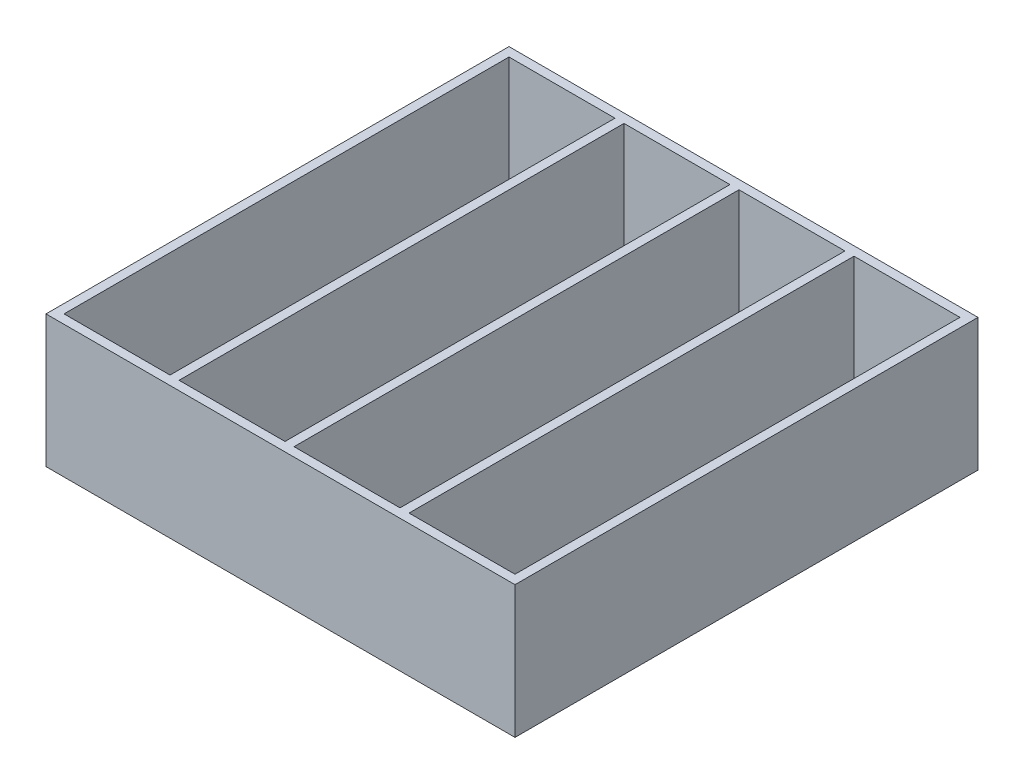
ISO-10303-21;
HEADER;
FILE_DESCRIPTION(('STEP AP214'),'2;1');
FILE_NAME('part.step','',(''),(''),'','','');
FILE_SCHEMA(('AUTOMOTIVE_DESIGN { 1 0 10303 214 1 1 1 1 }'));
ENDSEC;
DATA;
#1=APPLICATION_CONTEXT('core data for automotive mechanical design processes');
#2=APPLICATION_PROTOCOL_DEFINITION('international standard','automotive_design',2000,#1);
#3=PRODUCT_CONTEXT('',#1,'mechanical');
#4=PRODUCT('Part','Part','',(#3));
#5=PRODUCT_RELATED_PRODUCT_CATEGORY('part','',(#4));
#6=PRODUCT_DEFINITION_FORMATION('','',#4);
#7=PRODUCT_DEFINITION_CONTEXT('part definition',#1,'design');
#8=PRODUCT_DEFINITION('design','',#6,#7);
#9=PRODUCT_DEFINITION_SHAPE('','',#8);
#10=(LENGTH_UNIT() NAMED_UNIT(*) SI_UNIT(.MILLI.,.METRE.));
#11=(NAMED_UNIT(*) PLANE_ANGLE_UNIT() SI_UNIT($,.RADIAN.));
#12=(NAMED_UNIT(*) SI_UNIT($,.STERADIAN.) SOLID_ANGLE_UNIT());
#13=UNCERTAINTY_MEASURE_WITH_UNIT(LENGTH_MEASURE(1.E-05),#10,'distance_accuracy_value','');
#14=(GEOMETRIC_REPRESENTATION_CONTEXT(3) GLOBAL_UNCERTAINTY_ASSIGNED_CONTEXT((#13)) GLOBAL_UNIT_ASSIGNED_CONTEXT((#10,
#11,#12)) REPRESENTATION_CONTEXT('',''));
#15=CARTESIAN_POINT('',(0.,0.,0.));
#16=DIRECTION('',(0.,0.,1.));
#17=DIRECTION('',(1.,0.,0.));
#18=AXIS2_PLACEMENT_3D('',#15,#16,#17);
#19=CARTESIAN_POINT('',(0.,22.,0.));
#20=DIRECTION('',(-1.,0.,0.));
#21=DIRECTION('',(0.,0.,1.));
#22=AXIS2_PLACEMENT_3D('',#19,#20,#21);
#23=PLANE('',#22);
#24=DIRECTION('',(0.,0.,-1.));
#25=VECTOR('',#24,1.);
#26=CARTESIAN_POINT('',(0.,0.,0.));
#27=LINE('',#26,#25);
#28=CARTESIAN_POINT('',(0.,0.,77.));
#29=VERTEX_POINT('',#28);
#30=CARTESIAN_POINT('',(0.,0.,0.));
#31=VERTEX_POINT('',#30);
#32=EDGE_CURVE('E204',#29,#31,#27,.T.);
#33=ORIENTED_EDGE('',*,*,#32,.T.);
#34=DIRECTION('',(0.,-1.,0.));
#35=VECTOR('',#34,1.);
#36=CARTESIAN_POINT('',(0.,22.,0.));
#37=LINE('',#36,#35);
#38=CARTESIAN_POINT('',(0.,22.,0.));
#39=VERTEX_POINT('',#38);
#40=EDGE_CURVE('E11',#39,#31,#37,.T.);
#41=ORIENTED_EDGE('',*,*,#40,.F.);
#42=DIRECTION('',(0.,0.,-1.));
#43=VECTOR('',#42,1.);
#44=CARTESIAN_POINT('',(0.,22.,0.));
#45=LINE('',#44,#43);
#46=CARTESIAN_POINT('',(0.,22.,77.));
#47=VERTEX_POINT('',#46);
#48=EDGE_CURVE('E299',#47,#39,#45,.T.);
#49=ORIENTED_EDGE('',*,*,#48,.F.);
#50=DIRECTION('',(0.,-1.,0.));
#51=VECTOR('',#50,1.);
#52=CARTESIAN_POINT('',(0.,22.,77.));
#53=LINE('',#52,#51);
#54=EDGE_CURVE('E309',#47,#29,#53,.T.);
#55=ORIENTED_EDGE('',*,*,#54,.T.);
#56=EDGE_LOOP('',(#33,#41,#49,#55));
#57=FACE_BOUND('',#56,.T.);
#58=ADVANCED_FACE('F32',(#57),#23,.F.);
#59=CARTESIAN_POINT('',(0.,22.,0.));
#60=DIRECTION('',(0.,0.,1.));
#61=DIRECTION('',(1.,0.,0.));
#62=AXIS2_PLACEMENT_3D('',#59,#60,#61);
#63=PLANE('',#62);
#64=DIRECTION('',(-1.,0.,0.));
#65=VECTOR('',#64,1.);
#66=CARTESIAN_POINT('',(0.,0.,0.));
#67=LINE('',#66,#65);
#68=CARTESIAN_POINT('',(-78.,0.,0.));
#69=VERTEX_POINT('',#68);
#70=EDGE_CURVE('E312',#31,#69,#67,.T.);
#71=ORIENTED_EDGE('',*,*,#70,.T.);
#72=DIRECTION('',(0.,-1.,0.));
#73=VECTOR('',#72,1.);
#74=CARTESIAN_POINT('',(-78.,22.,0.));
#75=LINE('',#74,#73);
#76=CARTESIAN_POINT('',(-78.,22.,0.));
#77=VERTEX_POINT('',#76);
#78=EDGE_CURVE('E39',#77,#69,#75,.T.);
#79=ORIENTED_EDGE('',*,*,#78,.F.);
#80=DIRECTION('',(-1.,0.,0.));
#81=VECTOR('',#80,1.);
#82=CARTESIAN_POINT('',(0.,22.,0.));
#83=LINE('',#82,#81);
#84=EDGE_CURVE('E302',#39,#77,#83,.T.);
#85=ORIENTED_EDGE('',*,*,#84,.F.);
#86=ORIENTED_EDGE('',*,*,#40,.T.);
#87=EDGE_LOOP('',(#71,#79,#85,#86));
#88=FACE_BOUND('',#87,.T.);
#89=ADVANCED_FACE('F342',(#88),#63,.F.);
#90=CARTESIAN_POINT('',(-78.,22.,0.));
#91=DIRECTION('',(1.,0.,0.));
#92=DIRECTION('',(0.,0.,-1.));
#93=AXIS2_PLACEMENT_3D('',#90,#91,#92);
#94=PLANE('',#93);
#95=DIRECTION('',(0.,0.,1.));
#96=VECTOR('',#95,1.);
#97=CARTESIAN_POINT('',(-78.,0.,0.));
#98=LINE('',#97,#96);
#99=CARTESIAN_POINT('',(-78.,0.,77.));
#100=VERTEX_POINT('',#99);
#101=EDGE_CURVE('E314',#69,#100,#98,.T.);
#102=ORIENTED_EDGE('',*,*,#101,.T.);
#103=DIRECTION('',(0.,-1.,0.));
#104=VECTOR('',#103,1.);
#105=CARTESIAN_POINT('',(-78.,22.,77.));
#106=LINE('',#105,#104);
#107=CARTESIAN_POINT('',(-78.,22.,77.));
#108=VERTEX_POINT('',#107);
#109=EDGE_CURVE('E319',#108,#100,#106,.T.);
#110=ORIENTED_EDGE('',*,*,#109,.F.);
#111=DIRECTION('',(0.,0.,1.));
#112=VECTOR('',#111,1.);
#113=CARTESIAN_POINT('',(-78.,22.,0.));
#114=LINE('',#113,#112);
#115=EDGE_CURVE('E305',#77,#108,#114,.T.);
#116=ORIENTED_EDGE('',*,*,#115,.F.);
#117=ORIENTED_EDGE('',*,*,#78,.T.);
#118=EDGE_LOOP('',(#102,#110,#116,#117));
#119=FACE_BOUND('',#118,.T.);
#120=ADVANCED_FACE('F326',(#119),#94,.F.);
#121=CARTESIAN_POINT('',(0.,22.,77.));
#122=DIRECTION('',(0.,0.,-1.));
#123=DIRECTION('',(-1.,0.,0.));
#124=AXIS2_PLACEMENT_3D('',#121,#122,#123);
#125=PLANE('',#124);
#126=DIRECTION('',(1.,0.,0.));
#127=VECTOR('',#126,1.);
#128=CARTESIAN_POINT('',(0.,0.,77.));
#129=LINE('',#128,#127);
#130=EDGE_CURVE('E303',#100,#29,#129,.T.);
#131=ORIENTED_EDGE('',*,*,#130,.T.);
#132=ORIENTED_EDGE('',*,*,#54,.F.);
#133=DIRECTION('',(1.,0.,0.));
#134=VECTOR('',#133,1.);
#135=CARTESIAN_POINT('',(0.,22.,77.));
#136=LINE('',#135,#134);
#137=EDGE_CURVE('E307',#108,#47,#136,.T.);
#138=ORIENTED_EDGE('',*,*,#137,.F.);
#139=ORIENTED_EDGE('',*,*,#109,.T.);
#140=EDGE_LOOP('',(#131,#132,#138,#139));
#141=FACE_BOUND('',#140,.T.);
#142=ADVANCED_FACE('F335',(#141),#125,.F.);
#143=CARTESIAN_POINT('',(0.,22.,0.));
#144=DIRECTION('',(0.,-1.,0.));
#145=DIRECTION('',(0.,0.,-1.));
#146=AXIS2_PLACEMENT_3D('',#143,#144,#145);
#147=PLANE('',#146);
#148=DIRECTION('',(1.,0.,0.));
#149=VECTOR('',#148,1.);
#150=CARTESIAN_POINT('',(0.,22.,75.5));
#151=LINE('',#150,#149);
#152=CARTESIAN_POINT('',(-76.5,22.,75.5));
#153=VERTEX_POINT('',#152);
#154=CARTESIAN_POINT('',(-58.875,22.,75.5));
#155=VERTEX_POINT('',#154);
#156=EDGE_CURVE('E197',#153,#155,#151,.T.);
#157=ORIENTED_EDGE('',*,*,#156,.F.);
#158=DIRECTION('',(0.,0.,1.));
#159=VECTOR('',#158,1.);
#160=CARTESIAN_POINT('',(-76.5,22.,0.));
#161=LINE('',#160,#159);
#162=CARTESIAN_POINT('',(-76.5,22.,1.50000000000001));
#163=VERTEX_POINT('',#162);
#164=EDGE_CURVE('E46',#163,#153,#161,.T.);
#165=ORIENTED_EDGE('',*,*,#164,.F.);
#166=DIRECTION('',(-1.,0.,0.));
#167=VECTOR('',#166,1.);
#168=CARTESIAN_POINT('',(0.,22.,1.5));
#169=LINE('',#168,#167);
#170=CARTESIAN_POINT('',(-58.875,22.,1.50000000000002));
#171=VERTEX_POINT('',#170);
#172=EDGE_CURVE('E188',#171,#163,#169,.T.);
#173=ORIENTED_EDGE('',*,*,#172,.F.);
#174=DIRECTION('',(0.,0.,-1.));
#175=VECTOR('',#174,1.);
#176=CARTESIAN_POINT('',(-58.875,22.,0.));
#177=LINE('',#176,#175);
#178=EDGE_CURVE('E191',#155,#171,#177,.T.);
#179=ORIENTED_EDGE('',*,*,#178,.F.);
#180=EDGE_LOOP('',(#157,#165,#173,#179));
#181=FACE_BOUND('',#180,.T.);
#182=DIRECTION('',(1.,0.,0.));
#183=VECTOR('',#182,1.);
#184=CARTESIAN_POINT('',(0.,22.,75.5));
#185=LINE('',#184,#183);
#186=CARTESIAN_POINT('',(-57.375,22.,75.5));
#187=VERTEX_POINT('',#186);
#188=CARTESIAN_POINT('',(-39.75,22.,75.5));
#189=VERTEX_POINT('',#188);
#190=EDGE_CURVE('E222',#187,#189,#185,.T.);
#191=ORIENTED_EDGE('',*,*,#190,.F.);
#192=DIRECTION('',(0.,0.,1.));
#193=VECTOR('',#192,1.);
#194=CARTESIAN_POINT('',(-57.375,22.,0.));
#195=LINE('',#194,#193);
#196=CARTESIAN_POINT('',(-57.375,22.,1.50000000000001));
#197=VERTEX_POINT('',#196);
#198=EDGE_CURVE('E54',#197,#187,#195,.T.);
#199=ORIENTED_EDGE('',*,*,#198,.F.);
#200=DIRECTION('',(-1.,0.,0.));
#201=VECTOR('',#200,1.);
#202=CARTESIAN_POINT('',(0.,22.,1.5));
#203=LINE('',#202,#201);
#204=CARTESIAN_POINT('',(-39.75,22.,1.50000000000001));
#205=VERTEX_POINT('',#204);
#206=EDGE_CURVE('E212',#205,#197,#203,.T.);
#207=ORIENTED_EDGE('',*,*,#206,.F.);
#208=DIRECTION('',(0.,0.,1.));
#209=VECTOR('',#208,1.);
#210=CARTESIAN_POINT('',(-39.75,22.,0.));
#211=LINE('',#210,#209);
#212=EDGE_CURVE('E226',#205,#189,#211,.T.);
#213=ORIENTED_EDGE('',*,*,#212,.T.);
#214=EDGE_LOOP('',(#191,#199,#207,#213));
#215=FACE_BOUND('',#214,.T.);
#216=DIRECTION('',(-1.,0.,0.));
#217=VECTOR('',#216,1.);
#218=CARTESIAN_POINT('',(0.,22.,1.5));
#219=LINE('',#218,#217);
#220=CARTESIAN_POINT('',(-20.625,22.,1.5));
#221=VERTEX_POINT('',#220);
#222=CARTESIAN_POINT('',(-38.25,22.,1.5));
#223=VERTEX_POINT('',#222);
#224=EDGE_CURVE('E252',#221,#223,#219,.T.);
#225=ORIENTED_EDGE('',*,*,#224,.F.);
#226=DIRECTION('',(0.,0.,-1.));
#227=VECTOR('',#226,1.);
#228=CARTESIAN_POINT('',(-20.625,22.,0.));
#229=LINE('',#228,#227);
#230=CARTESIAN_POINT('',(-20.625,22.,75.5));
#231=VERTEX_POINT('',#230);
#232=EDGE_CURVE('E250',#231,#221,#229,.T.);
#233=ORIENTED_EDGE('',*,*,#232,.F.);
#234=DIRECTION('',(1.,0.,0.));
#235=VECTOR('',#234,1.);
#236=CARTESIAN_POINT('',(0.,22.,75.5));
#237=LINE('',#236,#235);
#238=CARTESIAN_POINT('',(-38.25,22.,75.5));
#239=VERTEX_POINT('',#238);
#240=EDGE_CURVE('E241',#239,#231,#237,.T.);
#241=ORIENTED_EDGE('',*,*,#240,.F.);
#242=DIRECTION('',(0.,0.,-1.));
#243=VECTOR('',#242,1.);
#244=CARTESIAN_POINT('',(-38.25,22.,0.));
#245=LINE('',#244,#243);
#246=EDGE_CURVE('E256',#239,#223,#245,.T.);
#247=ORIENTED_EDGE('',*,*,#246,.T.);
#248=EDGE_LOOP('',(#225,#233,#241,#247));
#249=FACE_BOUND('',#248,.T.);
#250=DIRECTION('',(1.,0.,0.));
#251=VECTOR('',#250,1.);
#252=CARTESIAN_POINT('',(0.,22.,75.5));
#253=LINE('',#252,#251);
#254=CARTESIAN_POINT('',(-19.125,22.,75.5));
#255=VERTEX_POINT('',#254);
#256=CARTESIAN_POINT('',(-1.5,22.,75.5));
#257=VERTEX_POINT('',#256);
#258=EDGE_CURVE('E284',#255,#257,#253,.T.);
#259=ORIENTED_EDGE('',*,*,#258,.F.);
#260=DIRECTION('',(0.,0.,1.));
#261=VECTOR('',#260,1.);
#262=CARTESIAN_POINT('',(-19.125,22.,0.));
#263=LINE('',#262,#261);
#264=CARTESIAN_POINT('',(-19.125,22.,1.5));
#265=VERTEX_POINT('',#264);
#266=EDGE_CURVE('E282',#265,#255,#263,.T.);
#267=ORIENTED_EDGE('',*,*,#266,.F.);
#268=DIRECTION('',(-1.,0.,0.));
#269=VECTOR('',#268,1.);
#270=CARTESIAN_POINT('',(0.,22.,1.5));
#271=LINE('',#270,#269);
#272=CARTESIAN_POINT('',(-1.5,22.,1.5));
#273=VERTEX_POINT('',#272);
#274=EDGE_CURVE('E272',#273,#265,#271,.T.);
#275=ORIENTED_EDGE('',*,*,#274,.F.);
#276=DIRECTION('',(0.,0.,-1.));
#277=VECTOR('',#276,1.);
#278=CARTESIAN_POINT('',(-1.5,22.,0.));
#279=LINE('',#278,#277);
#280=EDGE_CURVE('E287',#257,#273,#279,.T.);
#281=ORIENTED_EDGE('',*,*,#280,.F.);
#282=EDGE_LOOP('',(#259,#267,#275,#281));
#283=FACE_BOUND('',#282,.T.);
#284=ORIENTED_EDGE('',*,*,#48,.T.);
#285=ORIENTED_EDGE('',*,*,#84,.T.);
#286=ORIENTED_EDGE('',*,*,#115,.T.);
#287=ORIENTED_EDGE('',*,*,#137,.T.);
#288=EDGE_LOOP('',(#284,#285,#286,#287));
#289=FACE_BOUND('',#288,.T.);
#290=ADVANCED_FACE('F341',(#181,#215,#249,#283,#289),#147,.F.);
#291=CARTESIAN_POINT('',(0.,0.,0.));
#292=DIRECTION('',(0.,-1.,0.));
#293=DIRECTION('',(0.,0.,-1.));
#294=AXIS2_PLACEMENT_3D('',#291,#292,#293);
#295=PLANE('',#294);
#296=ORIENTED_EDGE('',*,*,#32,.F.);
#297=ORIENTED_EDGE('',*,*,#130,.F.);
#298=ORIENTED_EDGE('',*,*,#101,.F.);
#299=ORIENTED_EDGE('',*,*,#70,.F.);
#300=EDGE_LOOP('',(#296,#297,#298,#299));
#301=FACE_BOUND('',#300,.T.);
#302=ADVANCED_FACE('F332',(#301),#295,.T.);
#303=CARTESIAN_POINT('',(-19.125,2.,0.));
#304=DIRECTION('',(-1.,0.,0.));
#305=DIRECTION('',(0.,0.,1.));
#306=AXIS2_PLACEMENT_3D('',#303,#304,#305);
#307=PLANE('',#306);
#308=ORIENTED_EDGE('',*,*,#266,.T.);
#309=DIRECTION('',(0.,1.,0.));
#310=VECTOR('',#309,1.);
#311=CARTESIAN_POINT('',(-19.125,2.,75.5));
#312=LINE('',#311,#310);
#313=CARTESIAN_POINT('',(-19.125,2.,75.5));
#314=VERTEX_POINT('',#313);
#315=EDGE_CURVE('E281',#314,#255,#312,.T.);
#316=ORIENTED_EDGE('',*,*,#315,.F.);
#317=DIRECTION('',(0.,0.,1.));
#318=VECTOR('',#317,1.);
#319=CARTESIAN_POINT('',(-19.125,2.,0.));
#320=LINE('',#319,#318);
#321=CARTESIAN_POINT('',(-19.125,2.,1.5));
#322=VERTEX_POINT('',#321);
#323=EDGE_CURVE('E268',#322,#314,#320,.T.);
#324=ORIENTED_EDGE('',*,*,#323,.F.);
#325=DIRECTION('',(0.,1.,0.));
#326=VECTOR('',#325,1.);
#327=CARTESIAN_POINT('',(-19.125,2.,1.5));
#328=LINE('',#327,#326);
#329=EDGE_CURVE('E253',#322,#265,#328,.T.);
#330=ORIENTED_EDGE('',*,*,#329,.T.);
#331=EDGE_LOOP('',(#308,#316,#324,#330));
#332=FACE_BOUND('',#331,.T.);
#333=ADVANCED_FACE('F354',(#332),#307,.F.);
#334=CARTESIAN_POINT('',(0.,2.,1.5));
#335=DIRECTION('',(0.,0.,-1.));
#336=DIRECTION('',(-1.,0.,0.));
#337=AXIS2_PLACEMENT_3D('',#334,#335,#336);
#338=PLANE('',#337);
#339=ORIENTED_EDGE('',*,*,#274,.T.);
#340=ORIENTED_EDGE('',*,*,#329,.F.);
#341=DIRECTION('',(-1.,0.,0.));
#342=VECTOR('',#341,1.);
#343=CARTESIAN_POINT('',(0.,2.,1.5));
#344=LINE('',#343,#342);
#345=CARTESIAN_POINT('',(-1.5,2.,1.5));
#346=VERTEX_POINT('',#345);
#347=EDGE_CURVE('E278',#346,#322,#344,.T.);
#348=ORIENTED_EDGE('',*,*,#347,.F.);
#349=DIRECTION('',(0.,1.,0.));
#350=VECTOR('',#349,1.);
#351=CARTESIAN_POINT('',(-1.5,2.,1.5));
#352=LINE('',#351,#350);
#353=EDGE_CURVE('E293',#346,#273,#352,.T.);
#354=ORIENTED_EDGE('',*,*,#353,.T.);
#355=EDGE_LOOP('',(#339,#340,#348,#354));
#356=FACE_BOUND('',#355,.T.);
#357=ADVANCED_FACE('F360',(#356),#338,.F.);
#358=CARTESIAN_POINT('',(-1.5,2.,0.));
#359=DIRECTION('',(1.,0.,0.));
#360=DIRECTION('',(0.,0.,-1.));
#361=AXIS2_PLACEMENT_3D('',#358,#359,#360);
#362=PLANE('',#361);
#363=ORIENTED_EDGE('',*,*,#280,.T.);
#364=ORIENTED_EDGE('',*,*,#353,.F.);
#365=DIRECTION('',(0.,0.,-1.));
#366=VECTOR('',#365,1.);
#367=CARTESIAN_POINT('',(-1.5,2.,0.));
#368=LINE('',#367,#366);
#369=CARTESIAN_POINT('',(-1.5,2.,75.5));
#370=VERTEX_POINT('',#369);
#371=EDGE_CURVE('E275',#370,#346,#368,.T.);
#372=ORIENTED_EDGE('',*,*,#371,.F.);
#373=DIRECTION('',(0.,1.,0.));
#374=VECTOR('',#373,1.);
#375=CARTESIAN_POINT('',(-1.5,2.,75.5));
#376=LINE('',#375,#374);
#377=EDGE_CURVE('E295',#370,#257,#376,.T.);
#378=ORIENTED_EDGE('',*,*,#377,.T.);
#379=EDGE_LOOP('',(#363,#364,#372,#378));
#380=FACE_BOUND('',#379,.T.);
#381=ADVANCED_FACE('F366',(#380),#362,.F.);
#382=CARTESIAN_POINT('',(0.,2.,75.5));
#383=DIRECTION('',(0.,0.,1.));
#384=DIRECTION('',(1.,0.,0.));
#385=AXIS2_PLACEMENT_3D('',#382,#383,#384);
#386=PLANE('',#385);
#387=ORIENTED_EDGE('',*,*,#258,.T.);
#388=ORIENTED_EDGE('',*,*,#377,.F.);
#389=DIRECTION('',(1.,0.,0.));
#390=VECTOR('',#389,1.);
#391=CARTESIAN_POINT('',(0.,2.,75.5));
#392=LINE('',#391,#390);
#393=EDGE_CURVE('E271',#314,#370,#392,.T.);
#394=ORIENTED_EDGE('',*,*,#393,.F.);
#395=ORIENTED_EDGE('',*,*,#315,.T.);
#396=EDGE_LOOP('',(#387,#388,#394,#395));
#397=FACE_BOUND('',#396,.T.);
#398=ADVANCED_FACE('F362',(#397),#386,.F.);
#399=CARTESIAN_POINT('',(0.,2.,0.));
#400=DIRECTION('',(0.,1.,0.));
#401=DIRECTION('',(0.,0.,1.));
#402=AXIS2_PLACEMENT_3D('',#399,#400,#401);
#403=PLANE('',#402);
#404=ORIENTED_EDGE('',*,*,#323,.T.);
#405=ORIENTED_EDGE('',*,*,#393,.T.);
#406=ORIENTED_EDGE('',*,*,#371,.T.);
#407=ORIENTED_EDGE('',*,*,#347,.T.);
#408=EDGE_LOOP('',(#404,#405,#406,#407));
#409=FACE_BOUND('',#408,.T.);
#410=ADVANCED_FACE('F365',(#409),#403,.T.);
#411=CARTESIAN_POINT('',(-20.625,2.,0.));
#412=DIRECTION('',(1.,0.,0.));
#413=DIRECTION('',(0.,0.,-1.));
#414=AXIS2_PLACEMENT_3D('',#411,#412,#413);
#415=PLANE('',#414);
#416=ORIENTED_EDGE('',*,*,#232,.T.);
#417=DIRECTION('',(0.,1.,0.));
#418=VECTOR('',#417,1.);
#419=CARTESIAN_POINT('',(-20.625,2.,1.5));
#420=LINE('',#419,#418);
#421=CARTESIAN_POINT('',(-20.625,2.,1.5));
#422=VERTEX_POINT('',#421);
#423=EDGE_CURVE('E249',#422,#221,#420,.T.);
#424=ORIENTED_EDGE('',*,*,#423,.F.);
#425=DIRECTION('',(0.,0.,-1.));
#426=VECTOR('',#425,1.);
#427=CARTESIAN_POINT('',(-20.625,2.,0.));
#428=LINE('',#427,#426);
#429=CARTESIAN_POINT('',(-20.625,2.,75.5));
#430=VERTEX_POINT('',#429);
#431=EDGE_CURVE('E237',#430,#422,#428,.T.);
#432=ORIENTED_EDGE('',*,*,#431,.F.);
#433=DIRECTION('',(0.,1.,0.));
#434=VECTOR('',#433,1.);
#435=CARTESIAN_POINT('',(-20.625,2.,75.5));
#436=LINE('',#435,#434);
#437=EDGE_CURVE('E223',#430,#231,#436,.T.);
#438=ORIENTED_EDGE('',*,*,#437,.T.);
#439=EDGE_LOOP('',(#416,#424,#432,#438));
#440=FACE_BOUND('',#439,.T.);
#441=ADVANCED_FACE('F376',(#440),#415,.F.);
#442=CARTESIAN_POINT('',(0.,2.,75.5));
#443=DIRECTION('',(0.,0.,1.));
#444=DIRECTION('',(1.,0.,0.));
#445=AXIS2_PLACEMENT_3D('',#442,#443,#444);
#446=PLANE('',#445);
#447=ORIENTED_EDGE('',*,*,#240,.T.);
#448=ORIENTED_EDGE('',*,*,#437,.F.);
#449=DIRECTION('',(1.,0.,0.));
#450=VECTOR('',#449,1.);
#451=CARTESIAN_POINT('',(0.,2.,75.5));
#452=LINE('',#451,#450);
#453=CARTESIAN_POINT('',(-38.25,2.,75.5));
#454=VERTEX_POINT('',#453);
#455=EDGE_CURVE('E246',#454,#430,#452,.T.);
#456=ORIENTED_EDGE('',*,*,#455,.F.);
#457=DIRECTION('',(0.,1.,0.));
#458=VECTOR('',#457,1.);
#459=CARTESIAN_POINT('',(-38.25,2.,75.5));
#460=LINE('',#459,#458);
#461=EDGE_CURVE('E262',#454,#239,#460,.T.);
#462=ORIENTED_EDGE('',*,*,#461,.T.);
#463=EDGE_LOOP('',(#447,#448,#456,#462));
#464=FACE_BOUND('',#463,.T.);
#465=ADVANCED_FACE('F380',(#464),#446,.F.);
#466=CARTESIAN_POINT('',(-38.25,2.,0.));
#467=DIRECTION('',(1.,0.,0.));
#468=DIRECTION('',(0.,0.,-1.));
#469=AXIS2_PLACEMENT_3D('',#466,#467,#468);
#470=PLANE('',#469);
#471=ORIENTED_EDGE('',*,*,#246,.F.);
#472=ORIENTED_EDGE('',*,*,#461,.F.);
#473=DIRECTION('',(0.,0.,-1.));
#474=VECTOR('',#473,1.);
#475=CARTESIAN_POINT('',(-38.25,2.,0.));
#476=LINE('',#475,#474);
#477=CARTESIAN_POINT('',(-38.25,2.,1.5));
#478=VERTEX_POINT('',#477);
#479=EDGE_CURVE('E244',#454,#478,#476,.T.);
#480=ORIENTED_EDGE('',*,*,#479,.T.);
#481=DIRECTION('',(0.,1.,0.));
#482=VECTOR('',#481,1.);
#483=CARTESIAN_POINT('',(-38.25,2.,1.5));
#484=LINE('',#483,#482);
#485=EDGE_CURVE('E264',#478,#223,#484,.T.);
#486=ORIENTED_EDGE('',*,*,#485,.T.);
#487=EDGE_LOOP('',(#471,#472,#480,#486));
#488=FACE_BOUND('',#487,.T.);
#489=ADVANCED_FACE('F386',(#488),#470,.T.);
#490=CARTESIAN_POINT('',(0.,2.,1.5));
#491=DIRECTION('',(0.,0.,-1.));
#492=DIRECTION('',(-1.,0.,0.));
#493=AXIS2_PLACEMENT_3D('',#490,#491,#492);
#494=PLANE('',#493);
#495=ORIENTED_EDGE('',*,*,#224,.T.);
#496=ORIENTED_EDGE('',*,*,#485,.F.);
#497=DIRECTION('',(-1.,0.,0.));
#498=VECTOR('',#497,1.);
#499=CARTESIAN_POINT('',(0.,2.,1.5));
#500=LINE('',#499,#498);
#501=EDGE_CURVE('E240',#422,#478,#500,.T.);
#502=ORIENTED_EDGE('',*,*,#501,.F.);
#503=ORIENTED_EDGE('',*,*,#423,.T.);
#504=EDGE_LOOP('',(#495,#496,#502,#503));
#505=FACE_BOUND('',#504,.T.);
#506=ADVANCED_FACE('F382',(#505),#494,.F.);
#507=CARTESIAN_POINT('',(0.,2.,0.));
#508=DIRECTION('',(0.,1.,0.));
#509=DIRECTION('',(0.,0.,1.));
#510=AXIS2_PLACEMENT_3D('',#507,#508,#509);
#511=PLANE('',#510);
#512=ORIENTED_EDGE('',*,*,#431,.T.);
#513=ORIENTED_EDGE('',*,*,#501,.T.);
#514=ORIENTED_EDGE('',*,*,#479,.F.);
#515=ORIENTED_EDGE('',*,*,#455,.T.);
#516=EDGE_LOOP('',(#512,#513,#514,#515));
#517=FACE_BOUND('',#516,.T.);
#518=ADVANCED_FACE('F385',(#517),#511,.T.);
#519=CARTESIAN_POINT('',(-57.375,2.,0.));
#520=DIRECTION('',(-1.,0.,0.));
#521=DIRECTION('',(0.,0.,1.));
#522=AXIS2_PLACEMENT_3D('',#519,#520,#521);
#523=PLANE('',#522);
#524=ORIENTED_EDGE('',*,*,#198,.T.);
#525=DIRECTION('',(0.,1.,0.));
#526=VECTOR('',#525,1.);
#527=CARTESIAN_POINT('',(-57.375,2.,75.5));
#528=LINE('',#527,#526);
#529=CARTESIAN_POINT('',(-57.375,2.,75.5));
#530=VERTEX_POINT('',#529);
#531=EDGE_CURVE('E220',#530,#187,#528,.T.);
#532=ORIENTED_EDGE('',*,*,#531,.F.);
#533=DIRECTION('',(0.,0.,1.));
#534=VECTOR('',#533,1.);
#535=CARTESIAN_POINT('',(-57.375,2.,0.));
#536=LINE('',#535,#534);
#537=CARTESIAN_POINT('',(-57.375,2.,1.50000000000001));
#538=VERTEX_POINT('',#537);
#539=EDGE_CURVE('E208',#538,#530,#536,.T.);
#540=ORIENTED_EDGE('',*,*,#539,.F.);
#541=DIRECTION('',(0.,1.,0.));
#542=VECTOR('',#541,1.);
#543=CARTESIAN_POINT('',(-57.375,2.,1.50000000000001));
#544=LINE('',#543,#542);
#545=EDGE_CURVE('E198',#538,#197,#544,.T.);
#546=ORIENTED_EDGE('',*,*,#545,.T.);
#547=EDGE_LOOP('',(#524,#532,#540,#546));
#548=FACE_BOUND('',#547,.T.);
#549=ADVANCED_FACE('F396',(#548),#523,.F.);
#550=CARTESIAN_POINT('',(0.,2.,1.5));
#551=DIRECTION('',(0.,0.,-1.));
#552=DIRECTION('',(-1.,0.,0.));
#553=AXIS2_PLACEMENT_3D('',#550,#551,#552);
#554=PLANE('',#553);
#555=ORIENTED_EDGE('',*,*,#206,.T.);
#556=ORIENTED_EDGE('',*,*,#545,.F.);
#557=DIRECTION('',(-1.,0.,0.));
#558=VECTOR('',#557,1.);
#559=CARTESIAN_POINT('',(0.,2.,1.5));
#560=LINE('',#559,#558);
#561=CARTESIAN_POINT('',(-39.75,2.,1.50000000000001));
#562=VERTEX_POINT('',#561);
#563=EDGE_CURVE('E217',#562,#538,#560,.T.);
#564=ORIENTED_EDGE('',*,*,#563,.F.);
#565=DIRECTION('',(0.,1.,0.));
#566=VECTOR('',#565,1.);
#567=CARTESIAN_POINT('',(-39.75,2.,1.50000000000001));
#568=LINE('',#567,#566);
#569=EDGE_CURVE('E232',#562,#205,#568,.T.);
#570=ORIENTED_EDGE('',*,*,#569,.T.);
#571=EDGE_LOOP('',(#555,#556,#564,#570));
#572=FACE_BOUND('',#571,.T.);
#573=ADVANCED_FACE('F400',(#572),#554,.F.);
#574=CARTESIAN_POINT('',(-39.75,2.,0.));
#575=DIRECTION('',(-1.,0.,0.));
#576=DIRECTION('',(0.,0.,1.));
#577=AXIS2_PLACEMENT_3D('',#574,#575,#576);
#578=PLANE('',#577);
#579=ORIENTED_EDGE('',*,*,#212,.F.);
#580=ORIENTED_EDGE('',*,*,#569,.F.);
#581=DIRECTION('',(0.,0.,1.));
#582=VECTOR('',#581,1.);
#583=CARTESIAN_POINT('',(-39.75,2.,0.));
#584=LINE('',#583,#582);
#585=CARTESIAN_POINT('',(-39.75,2.,75.5));
#586=VERTEX_POINT('',#585);
#587=EDGE_CURVE('E215',#562,#586,#584,.T.);
#588=ORIENTED_EDGE('',*,*,#587,.T.);
#589=DIRECTION('',(0.,1.,0.));
#590=VECTOR('',#589,1.);
#591=CARTESIAN_POINT('',(-39.75,2.,75.5));
#592=LINE('',#591,#590);
#593=EDGE_CURVE('E234',#586,#189,#592,.T.);
#594=ORIENTED_EDGE('',*,*,#593,.T.);
#595=EDGE_LOOP('',(#579,#580,#588,#594));
#596=FACE_BOUND('',#595,.T.);
#597=ADVANCED_FACE('F405',(#596),#578,.T.);
#598=CARTESIAN_POINT('',(0.,2.,75.5));
#599=DIRECTION('',(0.,0.,1.));
#600=DIRECTION('',(1.,0.,0.));
#601=AXIS2_PLACEMENT_3D('',#598,#599,#600);
#602=PLANE('',#601);
#603=ORIENTED_EDGE('',*,*,#190,.T.);
#604=ORIENTED_EDGE('',*,*,#593,.F.);
#605=DIRECTION('',(1.,0.,0.));
#606=VECTOR('',#605,1.);
#607=CARTESIAN_POINT('',(0.,2.,75.5));
#608=LINE('',#607,#606);
#609=EDGE_CURVE('E211',#530,#586,#608,.T.);
#610=ORIENTED_EDGE('',*,*,#609,.F.);
#611=ORIENTED_EDGE('',*,*,#531,.T.);
#612=EDGE_LOOP('',(#603,#604,#610,#611));
#613=FACE_BOUND('',#612,.T.);
#614=ADVANCED_FACE('F401',(#613),#602,.F.);
#615=CARTESIAN_POINT('',(0.,2.,0.));
#616=DIRECTION('',(0.,1.,0.));
#617=DIRECTION('',(0.,0.,1.));
#618=AXIS2_PLACEMENT_3D('',#615,#616,#617);
#619=PLANE('',#618);
#620=ORIENTED_EDGE('',*,*,#539,.T.);
#621=ORIENTED_EDGE('',*,*,#609,.T.);
#622=ORIENTED_EDGE('',*,*,#587,.F.);
#623=ORIENTED_EDGE('',*,*,#563,.T.);
#624=EDGE_LOOP('',(#620,#621,#622,#623));
#625=FACE_BOUND('',#624,.T.);
#626=ADVANCED_FACE('F404',(#625),#619,.T.);
#627=CARTESIAN_POINT('',(-76.5,2.,0.));
#628=DIRECTION('',(-1.,0.,0.));
#629=DIRECTION('',(0.,0.,1.));
#630=AXIS2_PLACEMENT_3D('',#627,#628,#629);
#631=PLANE('',#630);
#632=ORIENTED_EDGE('',*,*,#164,.T.);
#633=DIRECTION('',(0.,1.,0.));
#634=VECTOR('',#633,1.);
#635=CARTESIAN_POINT('',(-76.5,2.,75.5));
#636=LINE('',#635,#634);
#637=CARTESIAN_POINT('',(-76.5,2.,75.5));
#638=VERTEX_POINT('',#637);
#639=EDGE_CURVE('E166',#638,#153,#636,.T.);
#640=ORIENTED_EDGE('',*,*,#639,.F.);
#641=DIRECTION('',(0.,0.,1.));
#642=VECTOR('',#641,1.);
#643=CARTESIAN_POINT('',(-76.5,2.,0.));
#644=LINE('',#643,#642);
#645=CARTESIAN_POINT('',(-76.5,2.,1.50000000000001));
#646=VERTEX_POINT('',#645);
#647=EDGE_CURVE('E170',#646,#638,#644,.T.);
#648=ORIENTED_EDGE('',*,*,#647,.F.);
#649=DIRECTION('',(0.,1.,0.));
#650=VECTOR('',#649,1.);
#651=CARTESIAN_POINT('',(-76.5,2.,1.50000000000001));
#652=LINE('',#651,#650);
#653=EDGE_CURVE('E202',#646,#163,#652,.T.);
#654=ORIENTED_EDGE('',*,*,#653,.T.);
#655=EDGE_LOOP('',(#632,#640,#648,#654));
#656=FACE_BOUND('',#655,.T.);
#657=ADVANCED_FACE('F168',(#656),#631,.F.);
#658=CARTESIAN_POINT('',(0.,2.,1.5));
#659=DIRECTION('',(0.,0.,-1.));
#660=DIRECTION('',(-1.,0.,0.));
#661=AXIS2_PLACEMENT_3D('',#658,#659,#660);
#662=PLANE('',#661);
#663=ORIENTED_EDGE('',*,*,#172,.T.);
#664=ORIENTED_EDGE('',*,*,#653,.F.);
#665=DIRECTION('',(-1.,0.,0.));
#666=VECTOR('',#665,1.);
#667=CARTESIAN_POINT('',(0.,2.,1.5));
#668=LINE('',#667,#666);
#669=CARTESIAN_POINT('',(-58.875,2.,1.50000000000002));
#670=VERTEX_POINT('',#669);
#671=EDGE_CURVE('E176',#670,#646,#668,.T.);
#672=ORIENTED_EDGE('',*,*,#671,.F.);
#673=DIRECTION('',(0.,1.,0.));
#674=VECTOR('',#673,1.);
#675=CARTESIAN_POINT('',(-58.875,2.,1.50000000000002));
#676=LINE('',#675,#674);
#677=EDGE_CURVE('E205',#670,#171,#676,.T.);
#678=ORIENTED_EDGE('',*,*,#677,.T.);
#679=EDGE_LOOP('',(#663,#664,#672,#678));
#680=FACE_BOUND('',#679,.T.);
#681=ADVANCED_FACE('F418',(#680),#662,.F.);
#682=CARTESIAN_POINT('',(-58.875,2.,0.));
#683=DIRECTION('',(1.,0.,0.));
#684=DIRECTION('',(0.,0.,-1.));
#685=AXIS2_PLACEMENT_3D('',#682,#683,#684);
#686=PLANE('',#685);
#687=ORIENTED_EDGE('',*,*,#178,.T.);
#688=ORIENTED_EDGE('',*,*,#677,.F.);
#689=DIRECTION('',(0.,0.,-1.));
#690=VECTOR('',#689,1.);
#691=CARTESIAN_POINT('',(-58.875,2.,0.));
#692=LINE('',#691,#690);
#693=CARTESIAN_POINT('',(-58.875,2.,75.5));
#694=VERTEX_POINT('',#693);
#695=EDGE_CURVE('E184',#694,#670,#692,.T.);
#696=ORIENTED_EDGE('',*,*,#695,.F.);
#697=DIRECTION('',(0.,1.,0.));
#698=VECTOR('',#697,1.);
#699=CARTESIAN_POINT('',(-58.875,2.,75.5));
#700=LINE('',#699,#698);
#701=EDGE_CURVE('E175',#694,#155,#700,.T.);
#702=ORIENTED_EDGE('',*,*,#701,.T.);
#703=EDGE_LOOP('',(#687,#688,#696,#702));
#704=FACE_BOUND('',#703,.T.);
#705=ADVANCED_FACE('F421',(#704),#686,.F.);
#706=CARTESIAN_POINT('',(0.,2.,75.5));
#707=DIRECTION('',(0.,0.,1.));
#708=DIRECTION('',(1.,0.,0.));
#709=AXIS2_PLACEMENT_3D('',#706,#707,#708);
#710=PLANE('',#709);
#711=ORIENTED_EDGE('',*,*,#156,.T.);
#712=ORIENTED_EDGE('',*,*,#701,.F.);
#713=DIRECTION('',(1.,0.,0.));
#714=VECTOR('',#713,1.);
#715=CARTESIAN_POINT('',(0.,2.,75.5));
#716=LINE('',#715,#714);
#717=EDGE_CURVE('E179',#638,#694,#716,.T.);
#718=ORIENTED_EDGE('',*,*,#717,.F.);
#719=ORIENTED_EDGE('',*,*,#639,.T.);
#720=EDGE_LOOP('',(#711,#712,#718,#719));
#721=FACE_BOUND('',#720,.T.);
#722=ADVANCED_FACE('F180',(#721),#710,.F.);
#723=CARTESIAN_POINT('',(0.,2.,0.));
#724=DIRECTION('',(0.,1.,0.));
#725=DIRECTION('',(0.,0.,1.));
#726=AXIS2_PLACEMENT_3D('',#723,#724,#725);
#727=PLANE('',#726);
#728=ORIENTED_EDGE('',*,*,#647,.T.);
#729=ORIENTED_EDGE('',*,*,#717,.T.);
#730=ORIENTED_EDGE('',*,*,#695,.T.);
#731=ORIENTED_EDGE('',*,*,#671,.T.);
#732=EDGE_LOOP('',(#728,#729,#730,#731));
#733=FACE_BOUND('',#732,.T.);
#734=ADVANCED_FACE('F186',(#733),#727,.T.);
#735=CLOSED_SHELL('',(#58,#89,#120,#142,#290,#302,#333,#357,#381,#398,#410,#441,#465,#489,#506,
#518,#549,#573,#597,#614,#626,#657,#681,#705,#722,#734));
#736=MANIFOLD_SOLID_BREP('B2',#735);
#737=ADVANCED_BREP_SHAPE_REPRESENTATION('',(#18,#736),#14);
#738=SHAPE_DEFINITION_REPRESENTATION(#9,#737);
ENDSEC;
END-ISO-10303-21;
